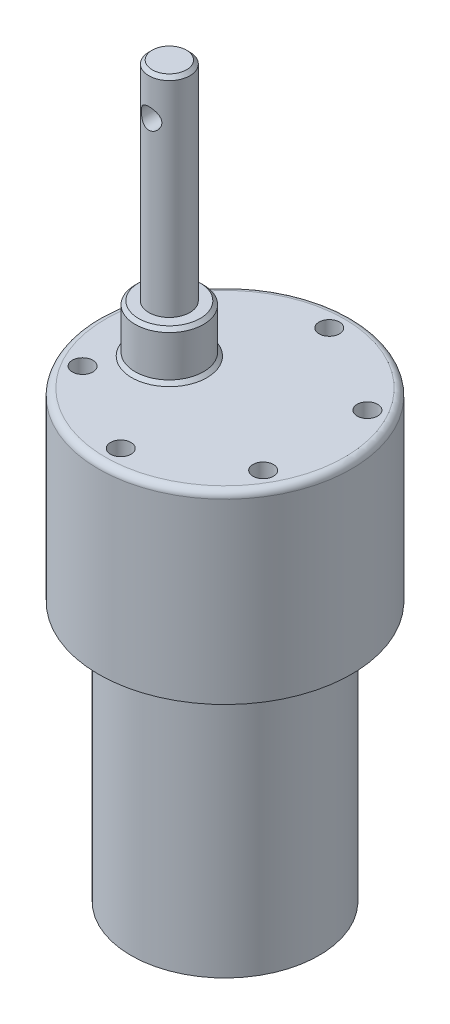
ISO-10303-21;
HEADER;
FILE_DESCRIPTION(('STEP AP214'),'2;1');
FILE_NAME('part.step','',(''),(''),'','','');
FILE_SCHEMA(('AUTOMOTIVE_DESIGN { 1 0 10303 214 1 1 1 1 }'));
ENDSEC;
DATA;
#1=APPLICATION_CONTEXT('core data for automotive mechanical design processes');
#2=APPLICATION_PROTOCOL_DEFINITION('international standard','automotive_design',2000,#1);
#3=PRODUCT_CONTEXT('',#1,'mechanical');
#4=PRODUCT('Part','Part','',(#3));
#5=PRODUCT_RELATED_PRODUCT_CATEGORY('part','',(#4));
#6=PRODUCT_DEFINITION_FORMATION('','',#4);
#7=PRODUCT_DEFINITION_CONTEXT('part definition',#1,'design');
#8=PRODUCT_DEFINITION('design','',#6,#7);
#9=PRODUCT_DEFINITION_SHAPE('','',#8);
#10=(LENGTH_UNIT() NAMED_UNIT(*) SI_UNIT(.MILLI.,.METRE.));
#11=(NAMED_UNIT(*) PLANE_ANGLE_UNIT() SI_UNIT($,.RADIAN.));
#12=(NAMED_UNIT(*) SI_UNIT($,.STERADIAN.) SOLID_ANGLE_UNIT());
#13=UNCERTAINTY_MEASURE_WITH_UNIT(LENGTH_MEASURE(1.E-05),#10,'distance_accuracy_value','');
#14=(GEOMETRIC_REPRESENTATION_CONTEXT(3) GLOBAL_UNCERTAINTY_ASSIGNED_CONTEXT((#13)) GLOBAL_UNIT_ASSIGNED_CONTEXT((#10,
#11,#12)) REPRESENTATION_CONTEXT('',''));
#15=CARTESIAN_POINT('',(0.,0.,0.));
#16=DIRECTION('',(0.,0.,1.));
#17=DIRECTION('',(1.,0.,0.));
#18=AXIS2_PLACEMENT_3D('',#15,#16,#17);
#19=CARTESIAN_POINT('',(-8.14075440092305,104.5,0.));
#20=DIRECTION('',(0.,-1.,0.));
#21=DIRECTION('',(0.,0.,-1.));
#22=AXIS2_PLACEMENT_3D('',#19,#20,#21);
#23=CYLINDRICAL_SURFACE('',#22,3.);
#24=CARTESIAN_POINT('',(-8.14075440092305,104.,0.));
#25=DIRECTION('',(0.,1.,0.));
#26=DIRECTION('',(0.,0.,1.));
#27=AXIS2_PLACEMENT_3D('',#24,#25,#26);
#28=CIRCLE('',#27,3.);
#29=CARTESIAN_POINT('',(-8.14075440092305,104.,3.));
#30=VERTEX_POINT('',#29);
#31=EDGE_CURVE('E45',#30,#30,#28,.F.);
#32=ORIENTED_EDGE('',*,*,#31,.T.);
#33=EDGE_LOOP('',(#32));
#34=FACE_BOUND('',#33,.T.);
#35=CARTESIAN_POINT('',(-8.14075440092305,74.,0.));
#36=DIRECTION('',(0.,1.,0.));
#37=DIRECTION('',(0.,0.,1.));
#38=AXIS2_PLACEMENT_3D('',#35,#36,#37);
#39=CIRCLE('',#38,3.);
#40=CARTESIAN_POINT('',(-8.14075440092305,74.,3.));
#41=VERTEX_POINT('',#40);
#42=EDGE_CURVE('E172',#41,#41,#39,.T.);
#43=ORIENTED_EDGE('',*,*,#42,.T.);
#44=EDGE_LOOP('',(#43));
#45=FACE_BOUND('',#44,.T.);
#46=CARTESIAN_POINT('',(-9.64075440092305,98.6,2.59807621135332));
#47=CARTESIAN_POINT('',(-9.64074894553484,98.5218382877071,2.59808302092689));
#48=CARTESIAN_POINT('',(-9.63460435702287,98.4435778827124,2.60165701781635));
#49=CARTESIAN_POINT('',(-9.61033921577012,98.2894591029843,2.61543549678079));
#50=CARTESIAN_POINT('',(-9.59219349775431,98.2136061274349,2.62565391083339));
#51=CARTESIAN_POINT('',(-9.54490432397276,98.0668225034841,2.65124019908098));
#52=CARTESIAN_POINT('',(-9.51581932966364,97.9958680212896,2.66658065209878));
#53=CARTESIAN_POINT('',(-9.4476556889876,97.8598636970049,2.70063997225287));
#54=CARTESIAN_POINT('',(-9.4085765019767,97.7948141746063,2.71935902214097));
#55=CARTESIAN_POINT('',(-9.31775421171936,97.6665414071637,2.75995303586162));
#56=CARTESIAN_POINT('',(-9.26523245513869,97.6039112964897,2.78196095456931));
#57=CARTESIAN_POINT('',(-9.15063511234474,97.4878874173899,2.82557974178559));
#58=CARTESIAN_POINT('',(-9.08855478959648,97.4344982561247,2.84719040746875));
#59=CARTESIAN_POINT('',(-8.95148874604486,97.3349492732785,2.88932215429424));
#60=CARTESIAN_POINT('',(-8.8759151844419,97.2895193482107,2.90967159627259));
#61=CARTESIAN_POINT('',(-8.71698994082229,97.2122887201314,2.94526134149294));
#62=CARTESIAN_POINT('',(-8.63364320813027,97.1804794157943,2.96050486775612));
#63=CARTESIAN_POINT('',(-8.46782181681201,97.1337430080484,2.98320691866356));
#64=CARTESIAN_POINT('',(-8.38570708665627,97.1177757104667,2.99114220331338));
#65=CARTESIAN_POINT('',(-8.21961034396982,97.0997508219874,3.00011375769101));
#66=CARTESIAN_POINT('',(-8.13562949215744,97.0976848148064,3.00115420176885));
#67=CARTESIAN_POINT('',(-7.97600561428742,97.1071200109555,2.99644472874675));
#68=CARTESIAN_POINT('',(-7.90027260215786,97.1174570232818,2.99127743838241));
#69=CARTESIAN_POINT('',(-7.75178374304556,97.149321265857,2.97561367889621));
#70=CARTESIAN_POINT('',(-7.67902811928216,97.1708493334643,2.96511681099591));
#71=CARTESIAN_POINT('',(-7.53729031356872,97.2246238491347,2.93957374931482));
#72=CARTESIAN_POINT('',(-7.46837426565028,97.2570144697581,2.92446662293799));
#73=CARTESIAN_POINT('',(-7.33678919865305,97.3313951243022,2.89106468980031));
#74=CARTESIAN_POINT('',(-7.27412242766508,97.3733885949535,2.87276874236226));
#75=CARTESIAN_POINT('',(-7.15049390957575,97.4703430272995,2.83266591598844));
#76=CARTESIAN_POINT('',(-7.09025328837901,97.526154542489,2.81069063997263));
#77=CARTESIAN_POINT('',(-6.97959784547638,97.6468845873953,2.76681510880218));
#78=CARTESIAN_POINT('',(-6.9291905835617,97.7118100584111,2.74491492398443));
#79=CARTESIAN_POINT('',(-6.83649639895973,97.8539722886361,2.70216234138727));
#80=CARTESIAN_POINT('',(-6.79492842845597,97.9317290345813,2.68146479986061));
#81=CARTESIAN_POINT('',(-6.7257757314212,98.0944065070385,2.64563175417864));
#82=CARTESIAN_POINT('',(-6.69817641360671,98.1793196495263,2.63049045069101));
#83=CARTESIAN_POINT('',(-6.65998408438549,98.3468217669242,2.60916953725552));
#84=CARTESIAN_POINT('',(-6.64821671774308,98.4290616785653,2.60237483772745));
#85=CARTESIAN_POINT('',(-6.6384789810059,98.5946020122748,2.59676879042414));
#86=CARTESIAN_POINT('',(-6.64049886495051,98.6779016436797,2.59795180333967));
#87=CARTESIAN_POINT('',(-6.6572003359071,98.8334808778681,2.60751504810877));
#88=CARTESIAN_POINT('',(-6.67047267585435,98.9059691766619,2.61509381259981));
#89=CARTESIAN_POINT('',(-6.70720997397439,99.0475516794064,2.63541032327012));
#90=CARTESIAN_POINT('',(-6.73067823298762,99.1166447761199,2.64814974007551));
#91=CARTESIAN_POINT('',(-6.78828301801571,99.253116996354,2.67804333119485));
#92=CARTESIAN_POINT('',(-6.82286330538396,99.3202685252803,2.69537464864595));
#93=CARTESIAN_POINT('',(-6.90132380489934,99.4482039073085,2.73234179245875));
#94=CARTESIAN_POINT('',(-6.94520879442473,99.5089844652699,2.75197880032722));
#95=CARTESIAN_POINT('',(-7.04749865012477,99.6304681512853,2.79431997684504));
#96=CARTESIAN_POINT('',(-7.1070364924506,99.6901957260765,2.81709874731434));
#97=CARTESIAN_POINT('',(-7.23564765782562,99.7991183569904,2.86101352466839));
#98=CARTESIAN_POINT('',(-7.30472418894003,99.8483098553458,2.88214897511564));
#99=CARTESIAN_POINT('',(-7.45295135708491,99.9358605889252,2.92112042536435));
#100=CARTESIAN_POINT('',(-7.53231975456187,99.9738996773164,2.93885462508044));
#101=CARTESIAN_POINT('',(-7.69747085396142,100.035706855786,2.96825032438951));
#102=CARTESIAN_POINT('',(-7.78324784883478,100.059487477049,2.9799171551456));
#103=CARTESIAN_POINT('',(-7.95028487742742,100.090052846262,2.99501262272824));
#104=CARTESIAN_POINT('',(-8.03123723514736,100.098196813814,2.99909891862287));
#105=CARTESIAN_POINT('',(-8.19344337984985,100.101264898182,3.00063195562697));
#106=CARTESIAN_POINT('',(-8.27469705136568,100.096193642785,2.99808102100335));
#107=CARTESIAN_POINT('',(-8.42956138939877,100.073875389807,2.98700953256884));
#108=CARTESIAN_POINT('',(-8.50332287763995,100.057452726113,2.97889342001985));
#109=CARTESIAN_POINT('',(-8.64692332919848,100.014009501046,2.95788140495135));
#110=CARTESIAN_POINT('',(-8.71676172835631,99.9869874198598,2.94498481699193));
#111=CARTESIAN_POINT('',(-8.85388951029038,99.9219094217511,2.9148889612218));
#112=CARTESIAN_POINT('',(-8.92094211497312,99.8834310151883,2.89752925798198));
#113=CARTESIAN_POINT('',(-9.04791636364408,99.7970631037114,2.86032199712739));
#114=CARTESIAN_POINT('',(-9.10783471204541,99.7491692763265,2.84047329837541));
#115=CARTESIAN_POINT('',(-9.22512540715839,99.6398042914659,2.79792915339941));
#116=CARTESIAN_POINT('',(-9.28165092773196,99.5774562687842,2.77514698517547));
#117=CARTESIAN_POINT('',(-9.38374933201506,99.4438239183054,2.73094614244278));
#118=CARTESIAN_POINT('',(-9.42931252593814,99.3725317686985,2.70952868642798));
#119=CARTESIAN_POINT('',(-9.50940102060153,99.2200450301286,2.66999407957374));
#120=CARTESIAN_POINT('',(-9.54353199986446,99.1386087033069,2.65200261384405));
#121=CARTESIAN_POINT('',(-9.59707246518266,98.9700013934903,2.62299234492527));
#122=CARTESIAN_POINT('',(-9.61653118768607,98.882850666631,2.61195024221553));
#123=CARTESIAN_POINT('',(-9.63230491271967,98.762291966522,2.60293908902686));
#124=CARTESIAN_POINT('',(-9.63546855836882,98.7299481584032,2.60112193507728));
#125=CARTESIAN_POINT('',(-9.63969450855799,98.6650752789766,2.59868903831625));
#126=CARTESIAN_POINT('',(-9.64075667252285,98.6325461954212,2.59807337587664));
#127=CARTESIAN_POINT('',(-9.64075440092305,98.6,2.59807621135332));
#128=B_SPLINE_CURVE_WITH_KNOTS('',3,(#46,#47,#48,#49,#50,#51,#52,#53,#54,#55,#56,#57,#58,#59,
#60,#61,#62,#63,#64,#65,#66,#67,#68,#69,#70,#71,#72,#73,#74,#75,#76,#77,#78,#79,#80,#81,#82,#83,
#84,#85,#86,#87,#88,#89,#90,#91,#92,#93,#94,#95,#96,#97,#98,#99,#100,#101,#102,#103,#104,#105,
#106,#107,#108,#109,#110,#111,#112,#113,#114,#115,#116,#117,#118,#119,#120,#121,#122,#123,#124,
#125,#126,#127),.UNSPECIFIED.,.T.,.F.,(4,2,2,2,2,2,2,2,2,2,2,2,2,2,2,2,2,2,2,2,2,2,2,2,2,2,2,2,
2,2,2,2,2,2,2,2,2,2,2,2,4),(0.,0.234348183892079,0.469189339237211,0.702792893878336,
0.936409088167741,1.18929346874736,1.44230356626558,1.71236838358146,1.98226240445837,
2.23295227451903,2.4834903552906,2.71224146226807,2.94100968776183,3.1729430209672,
3.40495949025408,3.65890787185336,3.91305072368878,4.18333262594172,4.45333161317557,
4.70193436281319,4.95036139782561,5.17161275136039,5.39293578654094,5.62450944609131,
5.85620229330071,6.11710115370921,6.37808797467302,6.64596272119448,6.91360169713157,
7.1566840558423,7.39968130190958,7.6266663730724,7.8536840026802,8.09041126079208,
8.32724745151079,8.58765362775102,8.84828914267732,9.11716123557908,9.38512699504142,
9.48270202777964,9.58028358741811),.UNSPECIFIED.);
#129=CARTESIAN_POINT('',(-9.64075440092305,98.6,2.59807621135332));
#130=VERTEX_POINT('',#129);
#131=EDGE_CURVE('E86',#130,#130,#128,.T.);
#132=ORIENTED_EDGE('',*,*,#131,.F.);
#133=EDGE_LOOP('',(#132));
#134=FACE_BOUND('',#133,.T.);
#135=CARTESIAN_POINT('',(-8.14075440092305,100.1,-3.));
#136=CARTESIAN_POINT('',(-8.06189645649619,100.099995046524,-2.99999570107562));
#137=CARTESIAN_POINT('',(-7.9829445013767,100.093744890318,-2.99685736529635));
#138=CARTESIAN_POINT('',(-7.8273740480197,100.069020679488,-2.98461234055736));
#139=CARTESIAN_POINT('',(-7.7507602708526,100.050523410503,-2.97549431743379));
#140=CARTESIAN_POINT('',(-7.60235408360237,100.002209287075,-2.95224419105063));
#141=CARTESIAN_POINT('',(-7.53054419651432,99.9724364236281,-2.93813158766306));
#142=CARTESIAN_POINT('',(-7.39304547571314,99.9026440679525,-2.90618664773642));
#143=CARTESIAN_POINT('',(-7.32735615993795,99.8626253836267,-2.88835460450288));
#144=CARTESIAN_POINT('',(-7.19949267428018,99.7707241257721,-2.84934387387093));
#145=CARTESIAN_POINT('',(-7.13777158423988,99.7182702811405,-2.82802798691306));
#146=CARTESIAN_POINT('',(-7.02358523362258,99.6042177811294,-2.78489955370115));
#147=CARTESIAN_POINT('',(-6.97112702626289,99.5426122223413,-2.76308664313552));
#148=CARTESIAN_POINT('',(-6.87287640024763,99.4062749757149,-2.71948426796021));
#149=CARTESIAN_POINT('',(-6.82791639759559,99.3308958524811,-2.69782780455198));
#150=CARTESIAN_POINT('',(-6.751502060587,99.1724489960207,-2.65928968158481));
#151=CARTESIAN_POINT('',(-6.72003807847354,99.0893868069159,-2.64240461410484));
#152=CARTESIAN_POINT('',(-6.67355573764016,98.9230023418671,-2.61686800556713));
#153=CARTESIAN_POINT('',(-6.65766561530238,98.8399933218989,-2.6077840737557));
#154=CARTESIAN_POINT('',(-6.64011391095978,98.6720317433308,-2.59772834922792));
#155=CARTESIAN_POINT('',(-6.63843826836343,98.5870811886933,-2.59674854014932));
#156=CARTESIAN_POINT('',(-6.6487234701646,98.428570963527,-2.60266395385873));
#157=CARTESIAN_POINT('',(-6.65907756161781,98.3548639531654,-2.6086314549302));
#158=CARTESIAN_POINT('',(-6.69034462733765,98.2104171359404,-2.62614343100775));
#159=CARTESIAN_POINT('',(-6.71126096507656,98.139678282042,-2.63768968247664));
#160=CARTESIAN_POINT('',(-6.76343973034404,98.0011563011515,-2.66531214619111));
#161=CARTESIAN_POINT('',(-6.79493180024905,97.9334804018213,-2.68148760995998));
#162=CARTESIAN_POINT('',(-6.86719186942104,97.804048561115,-2.71655106422105));
#163=CARTESIAN_POINT('',(-6.90796403520434,97.7422952965999,-2.73544027170286));
#164=CARTESIAN_POINT('',(-7.00365531855386,97.6182181208852,-2.77669736854929));
#165=CARTESIAN_POINT('',(-7.05971271336912,97.5568146896358,-2.79920265355119));
#166=CARTESIAN_POINT('',(-7.18142103281099,97.4438968721136,-2.84321434950611));
#167=CARTESIAN_POINT('',(-7.24707651606162,97.3923872119492,-2.86472027938201));
#168=CARTESIAN_POINT('',(-7.38997964217527,97.2984715084554,-2.90552980924446));
#169=CARTESIAN_POINT('',(-7.46762401352394,97.2565992913314,-2.92468476243011));
#170=CARTESIAN_POINT('',(-7.63005507768985,97.1868544564355,-2.95736821681863));
#171=CARTESIAN_POINT('',(-7.71483603652513,97.1589707224772,-2.9709011841533));
#172=CARTESIAN_POINT('',(-7.88160466343199,97.120286894425,-2.98986500612153));
#173=CARTESIAN_POINT('',(-7.96324210510055,97.1082631463798,-2.99587407451965));
#174=CARTESIAN_POINT('',(-8.12758500099901,97.0978029032983,-3.00109520188655));
#175=CARTESIAN_POINT('',(-8.2102899307279,97.0993599715408,-3.00031048081978));
#176=CARTESIAN_POINT('',(-8.36760385890202,97.1153100326281,-2.99236788380152));
#177=CARTESIAN_POINT('',(-8.44234351299794,97.128698799095,-2.98570868532252));
#178=CARTESIAN_POINT('',(-8.58836473937596,97.1663571078427,-2.9673325697226));
#179=CARTESIAN_POINT('',(-8.65964592945967,97.1906278496802,-2.95561509501618));
#180=CARTESIAN_POINT('',(-8.7990873135974,97.2499976996496,-2.92776377120382));
#181=CARTESIAN_POINT('',(-8.86709999643175,97.2853865751744,-2.91151322654446));
#182=CARTESIAN_POINT('',(-8.99644644347195,97.3656613034698,-2.87615961476126));
#183=CARTESIAN_POINT('',(-9.05777734558793,97.4105512018931,-2.85705533350407));
#184=CARTESIAN_POINT('',(-9.17840593485687,97.5136406379961,-2.81562332004297));
#185=CARTESIAN_POINT('',(-9.23691251765158,97.5727143026677,-2.79316327265249));
#186=CARTESIAN_POINT('',(-9.34353888260133,97.6998877269166,-2.7489358741323));
#187=CARTESIAN_POINT('',(-9.39165147949085,97.7679936782719,-2.72716901100071));
#188=CARTESIAN_POINT('',(-9.47831627264157,97.9154654812595,-2.68576788309734));
#189=CARTESIAN_POINT('',(-9.51629264462342,97.9952168991417,-2.66628794383591));
#190=CARTESIAN_POINT('',(-9.5778786398251,98.1612651013625,-2.63361108441202));
#191=CARTESIAN_POINT('',(-9.60150677472357,98.2475532897003,-2.62040607332625));
#192=CARTESIAN_POINT('',(-9.63154693212335,98.4153653343271,-2.60342251538703));
#193=CARTESIAN_POINT('',(-9.63939389553122,98.4965513801529,-2.59886075197597));
#194=CARTESIAN_POINT('',(-9.64178813248735,98.6591706007468,-2.59748031962405));
#195=CARTESIAN_POINT('',(-9.63634117085791,98.7406036531068,-2.60065829439585));
#196=CARTESIAN_POINT('',(-9.61364358931301,98.8932252523002,-2.61356793076615));
#197=CARTESIAN_POINT('',(-9.5975668724376,98.9646507052171,-2.62264641723988));
#198=CARTESIAN_POINT('',(-9.55551743825966,99.1037121791366,-2.64556524281479));
#199=CARTESIAN_POINT('',(-9.52954153766293,99.171346973138,-2.65940711354503));
#200=CARTESIAN_POINT('',(-9.46647801887389,99.3059372764798,-2.69142795546804));
#201=CARTESIAN_POINT('',(-9.4287611076466,99.3725418527436,-2.70983583593881));
#202=CARTESIAN_POINT('',(-9.34398085837914,99.4989118042719,-2.7485299745229));
#203=CARTESIAN_POINT('',(-9.29691265778539,99.5586735957817,-2.76881720693416));
#204=CARTESIAN_POINT('',(-9.18805939091511,99.677212973532,-2.81193484737138));
#205=CARTESIAN_POINT('',(-9.12518103541895,99.7349886535254,-2.83477474959942));
#206=CARTESIAN_POINT('',(-8.98998661027285,99.8393944751529,-2.87816628389896));
#207=CARTESIAN_POINT('',(-8.91766548588085,99.8860186092049,-2.89871667939292));
#208=CARTESIAN_POINT('',(-8.76465179609746,99.9668545440681,-2.93547014349806));
#209=CARTESIAN_POINT('',(-8.68390365658814,100.000976253855,-2.95164144740899));
#210=CARTESIAN_POINT('',(-8.51686755263017,100.054712251636,-2.9775201194848));
#211=CARTESIAN_POINT('',(-8.43059610030669,100.074367770209,-2.98724585044602));
#212=CARTESIAN_POINT('',(-8.30965732065938,100.090846116629,-2.99543192870217));
#213=CARTESIAN_POINT('',(-8.27599722008539,100.0942739613,-2.99714048010376));
#214=CARTESIAN_POINT('',(-8.20848199863068,100.098851998271,-2.99942545465223));
#215=CARTESIAN_POINT('',(-8.17462687239298,100.100002127705,-3.00000184655071));
#216=CARTESIAN_POINT('',(-8.14075440092305,100.1,-3.));
#217=B_SPLINE_CURVE_WITH_KNOTS('',3,(#135,#136,#137,#138,#139,#140,#141,#142,#143,#144,#145,
#146,#147,#148,#149,#150,#151,#152,#153,#154,#155,#156,#157,#158,#159,#160,#161,#162,#163,#164,
#165,#166,#167,#168,#169,#170,#171,#172,#173,#174,#175,#176,#177,#178,#179,#180,#181,#182,#183,
#184,#185,#186,#187,#188,#189,#190,#191,#192,#193,#194,#195,#196,#197,#198,#199,#200,#201,#202,
#203,#204,#205,#206,#207,#208,#209,#210,#211,#212,#213,#214,#215,#216),.UNSPECIFIED.,.T.,.F.,(4,
2,2,2,2,2,2,2,2,2,2,2,2,2,2,2,2,2,2,2,2,2,2,2,2,2,2,2,2,2,2,2,2,2,2,2,2,2,2,2,4),(0.,
0.236436386130441,0.473322224563798,0.709293233238445,0.945245640872355,1.19547263807713,
1.44588935648105,1.7157258964613,1.98536921847421,2.23887018210343,2.4921203599353,
2.71508568613982,2.93812205888517,3.16635360252731,3.39468781890332,3.65197412000818,
3.9093830189803,4.17874533321662,4.44789325368419,4.69474935707018,4.94148846767214,
5.16910359759183,5.39674382446397,5.63089284041848,5.86514176122509,6.12239415966629,
6.37982382923147,6.6497202324259,6.91926767918176,7.1629396125457,7.40650589797018,
7.62686895373282,7.84730293182526,8.0825468517043,8.31791341715445,8.58187864135756,
8.84598575071868,9.1119602049529,9.37717362931724,9.47872920200876,9.58028757766599),.UNSPECIFIED.);
#218=CARTESIAN_POINT('',(-8.14075440092305,100.1,-3.));
#219=VERTEX_POINT('',#218);
#220=EDGE_CURVE('E78',#219,#219,#217,.T.);
#221=ORIENTED_EDGE('',*,*,#220,.F.);
#222=EDGE_LOOP('',(#221));
#223=FACE_BOUND('',#222,.T.);
#224=ADVANCED_FACE('F33',(#34,#45,#134,#223),#23,.T.);
#225=CARTESIAN_POINT('',(0.,67.,0.));
#226=DIRECTION('',(0.,-1.,0.));
#227=DIRECTION('',(0.,0.,-1.));
#228=AXIS2_PLACEMENT_3D('',#225,#226,#227);
#229=PLANE('',#228);
#230=CARTESIAN_POINT('',(0.,67.,0.));
#231=DIRECTION('',(0.,-1.,0.));
#232=DIRECTION('',(0.,0.,-1.));
#233=AXIS2_PLACEMENT_3D('',#230,#231,#232);
#234=CIRCLE('',#233,17.5);
#235=CARTESIAN_POINT('',(0.,67.,-17.5));
#236=VERTEX_POINT('',#235);
#237=EDGE_CURVE('E41',#236,#236,#234,.F.);
#238=ORIENTED_EDGE('',*,*,#237,.T.);
#239=EDGE_LOOP('',(#238));
#240=FACE_BOUND('',#239,.T.);
#241=CARTESIAN_POINT('',(-8.14075440092305,67.,0.));
#242=DIRECTION('',(0.,-1.,0.));
#243=DIRECTION('',(0.,0.,-1.));
#244=AXIS2_PLACEMENT_3D('',#241,#242,#243);
#245=CIRCLE('',#244,5.49999999999999);
#246=CARTESIAN_POINT('',(-8.14075440092305,67.,-5.49999999999999));
#247=VERTEX_POINT('',#246);
#248=EDGE_CURVE('E68',#247,#247,#245,.T.);
#249=ORIENTED_EDGE('',*,*,#248,.T.);
#250=EDGE_LOOP('',(#249));
#251=FACE_BOUND('',#250,.T.);
#252=CARTESIAN_POINT('',(13.2068874077127,67.,-7.62499999999991));
#253=DIRECTION('',(0.,1.,0.));
#254=DIRECTION('',(0.,0.,1.));
#255=AXIS2_PLACEMENT_3D('',#252,#253,#254);
#256=CIRCLE('',#255,1.49999999999994);
#257=CARTESIAN_POINT('',(13.2068874077127,67.,-6.12499999999998));
#258=VERTEX_POINT('',#257);
#259=EDGE_CURVE('E191',#258,#258,#256,.T.);
#260=ORIENTED_EDGE('',*,*,#259,.F.);
#261=EDGE_LOOP('',(#260));
#262=FACE_BOUND('',#261,.T.);
#263=CARTESIAN_POINT('',(13.2068874077129,67.,7.62500000000009));
#264=DIRECTION('',(0.,1.,0.));
#265=DIRECTION('',(0.,0.,1.));
#266=AXIS2_PLACEMENT_3D('',#263,#264,#265);
#267=CIRCLE('',#266,1.50000000000002);
#268=CARTESIAN_POINT('',(13.2068874077129,67.,9.12500000000011));
#269=VERTEX_POINT('',#268);
#270=EDGE_CURVE('E197',#269,#269,#267,.T.);
#271=ORIENTED_EDGE('',*,*,#270,.F.);
#272=EDGE_LOOP('',(#271));
#273=FACE_BOUND('',#272,.T.);
#274=CARTESIAN_POINT('',(2.17809831826543E-13,67.,15.2500000000002));
#275=DIRECTION('',(0.,1.,0.));
#276=DIRECTION('',(0.,0.,1.));
#277=AXIS2_PLACEMENT_3D('',#274,#275,#276);
#278=CIRCLE('',#277,1.50000000000026);
#279=CARTESIAN_POINT('',(2.17809831826543E-13,67.,16.7500000000004));
#280=VERTEX_POINT('',#279);
#281=EDGE_CURVE('E203',#280,#280,#278,.T.);
#282=ORIENTED_EDGE('',*,*,#281,.F.);
#283=EDGE_LOOP('',(#282));
#284=FACE_BOUND('',#283,.T.);
#285=CARTESIAN_POINT('',(-13.2068874077125,67.,7.62500000000029));
#286=DIRECTION('',(0.,1.,0.));
#287=DIRECTION('',(0.,0.,1.));
#288=AXIS2_PLACEMENT_3D('',#285,#286,#287);
#289=CIRCLE('',#288,1.50000000000045);
#290=CARTESIAN_POINT('',(-13.2068874077125,67.,9.12500000000074));
#291=VERTEX_POINT('',#290);
#292=EDGE_CURVE('E209',#291,#291,#289,.T.);
#293=ORIENTED_EDGE('',*,*,#292,.F.);
#294=EDGE_LOOP('',(#293));
#295=FACE_BOUND('',#294,.T.);
#296=CARTESIAN_POINT('',(-13.2068874077127,67.,-7.62499999999999));
#297=DIRECTION('',(0.,1.,0.));
#298=DIRECTION('',(0.,0.,1.));
#299=AXIS2_PLACEMENT_3D('',#296,#297,#298);
#300=CIRCLE('',#299,1.50000000000018);
#301=CARTESIAN_POINT('',(-13.2068874077127,67.,-6.12499999999981));
#302=VERTEX_POINT('',#301);
#303=EDGE_CURVE('E85',#302,#302,#300,.T.);
#304=ORIENTED_EDGE('',*,*,#303,.F.);
#305=EDGE_LOOP('',(#304));
#306=FACE_BOUND('',#305,.T.);
#307=CARTESIAN_POINT('',(0.,67.,-15.2499999999998));
#308=DIRECTION('',(0.,1.,0.));
#309=DIRECTION('',(0.,0.,1.));
#310=AXIS2_PLACEMENT_3D('',#307,#308,#309);
#311=CIRCLE('',#310,1.50000000000005);
#312=CARTESIAN_POINT('',(0.,67.,-13.7499999999998));
#313=VERTEX_POINT('',#312);
#314=EDGE_CURVE('E190',#313,#313,#311,.T.);
#315=ORIENTED_EDGE('',*,*,#314,.F.);
#316=EDGE_LOOP('',(#315));
#317=FACE_BOUND('',#316,.T.);
#318=ADVANCED_FACE('F159',(#240,#251,#262,#273,#284,#295,#306,#317),#229,.F.);
#319=CARTESIAN_POINT('',(0.,116.312873797507,0.));
#320=DIRECTION('',(0.,1.,0.));
#321=DIRECTION('',(0.,0.,1.));
#322=AXIS2_PLACEMENT_3D('',#319,#320,#321);
#323=CYLINDRICAL_SURFACE('',#322,18.5);
#324=CARTESIAN_POINT('',(0.,66.,0.));
#325=DIRECTION('',(0.,-1.,0.));
#326=DIRECTION('',(0.,0.,-1.));
#327=AXIS2_PLACEMENT_3D('',#324,#325,#326);
#328=CIRCLE('',#327,18.5);
#329=CARTESIAN_POINT('',(0.,66.,-18.5));
#330=VERTEX_POINT('',#329);
#331=EDGE_CURVE('E10',#330,#330,#328,.T.);
#332=ORIENTED_EDGE('',*,*,#331,.T.);
#333=EDGE_LOOP('',(#332));
#334=FACE_BOUND('',#333,.T.);
#335=CARTESIAN_POINT('',(0.,40.,0.));
#336=DIRECTION('',(0.,1.,0.));
#337=DIRECTION('',(0.,0.,1.));
#338=AXIS2_PLACEMENT_3D('',#335,#336,#337);
#339=CIRCLE('',#338,18.5);
#340=CARTESIAN_POINT('',(0.,40.,18.5));
#341=VERTEX_POINT('',#340);
#342=EDGE_CURVE('E77',#341,#341,#339,.T.);
#343=ORIENTED_EDGE('',*,*,#342,.T.);
#344=EDGE_LOOP('',(#343));
#345=FACE_BOUND('',#344,.T.);
#346=ADVANCED_FACE('F164',(#334,#345),#323,.T.);
#347=CARTESIAN_POINT('',(18.5,40.,0.));
#348=DIRECTION('',(0.,1.,0.));
#349=DIRECTION('',(0.,0.,1.));
#350=AXIS2_PLACEMENT_3D('',#347,#348,#349);
#351=PLANE('',#350);
#352=ORIENTED_EDGE('',*,*,#342,.F.);
#353=EDGE_LOOP('',(#352));
#354=FACE_BOUND('',#353,.T.);
#355=CARTESIAN_POINT('',(0.,40.,0.));
#356=DIRECTION('',(0.,1.,0.));
#357=DIRECTION('',(0.,0.,1.));
#358=AXIS2_PLACEMENT_3D('',#355,#356,#357);
#359=CIRCLE('',#358,12.2695434015442);
#360=CARTESIAN_POINT('',(0.,40.,12.2695434015442));
#361=VERTEX_POINT('',#360);
#362=EDGE_CURVE('E179',#361,#361,#359,.T.);
#363=ORIENTED_EDGE('',*,*,#362,.T.);
#364=EDGE_LOOP('',(#363));
#365=FACE_BOUND('',#364,.T.);
#366=ADVANCED_FACE('F229',(#354,#365),#351,.F.);
#367=CARTESIAN_POINT('',(-8.14075440092305,74.,0.));
#368=DIRECTION('',(0.,-1.,0.));
#369=DIRECTION('',(0.,0.,-1.));
#370=AXIS2_PLACEMENT_3D('',#367,#368,#369);
#371=CYLINDRICAL_SURFACE('',#370,5.);
#372=CARTESIAN_POINT('',(-8.14075440092305,67.5,0.));
#373=DIRECTION('',(0.,-1.,0.));
#374=DIRECTION('',(0.,0.,-1.));
#375=AXIS2_PLACEMENT_3D('',#372,#373,#374);
#376=CIRCLE('',#375,5.);
#377=CARTESIAN_POINT('',(-8.14075440092305,67.5,-5.));
#378=VERTEX_POINT('',#377);
#379=EDGE_CURVE('E71',#378,#378,#376,.F.);
#380=ORIENTED_EDGE('',*,*,#379,.T.);
#381=EDGE_LOOP('',(#380));
#382=FACE_BOUND('',#381,.T.);
#383=CARTESIAN_POINT('',(-8.14075440092305,73.5,0.));
#384=DIRECTION('',(0.,1.,0.));
#385=DIRECTION('',(0.,0.,1.));
#386=AXIS2_PLACEMENT_3D('',#383,#384,#385);
#387=CIRCLE('',#386,5.);
#388=CARTESIAN_POINT('',(-8.14075440092305,73.5,5.));
#389=VERTEX_POINT('',#388);
#390=EDGE_CURVE('E74',#389,#389,#387,.F.);
#391=ORIENTED_EDGE('',*,*,#390,.T.);
#392=EDGE_LOOP('',(#391));
#393=FACE_BOUND('',#392,.T.);
#394=ADVANCED_FACE('F156',(#382,#393),#371,.T.);
#395=CARTESIAN_POINT('',(-8.14075440092305,74.,0.));
#396=DIRECTION('',(0.,1.,0.));
#397=DIRECTION('',(0.,0.,1.));
#398=AXIS2_PLACEMENT_3D('',#395,#396,#397);
#399=PLANE('',#398);
#400=CARTESIAN_POINT('',(-8.14075440092305,74.,0.));
#401=DIRECTION('',(0.,1.,0.));
#402=DIRECTION('',(0.,0.,1.));
#403=AXIS2_PLACEMENT_3D('',#400,#401,#402);
#404=CIRCLE('',#403,4.5);
#405=CARTESIAN_POINT('',(-8.14075440092305,74.,4.5));
#406=VERTEX_POINT('',#405);
#407=EDGE_CURVE('E65',#406,#406,#404,.T.);
#408=ORIENTED_EDGE('',*,*,#407,.T.);
#409=EDGE_LOOP('',(#408));
#410=FACE_BOUND('',#409,.T.);
#411=ORIENTED_EDGE('',*,*,#42,.F.);
#412=EDGE_LOOP('',(#411));
#413=FACE_BOUND('',#412,.T.);
#414=ADVANCED_FACE('F151',(#410,#413),#399,.T.);
#415=CARTESIAN_POINT('',(-8.14075440092305,104.5,0.));
#416=DIRECTION('',(0.,1.,0.));
#417=DIRECTION('',(0.,0.,1.));
#418=AXIS2_PLACEMENT_3D('',#415,#416,#417);
#419=PLANE('',#418);
#420=CARTESIAN_POINT('',(-8.14075440092305,104.5,0.));
#421=DIRECTION('',(0.,1.,0.));
#422=DIRECTION('',(0.,0.,1.));
#423=AXIS2_PLACEMENT_3D('',#420,#421,#422);
#424=CIRCLE('',#423,2.50000000000007);
#425=CARTESIAN_POINT('',(-8.14075440092305,104.5,2.50000000000007));
#426=VERTEX_POINT('',#425);
#427=EDGE_CURVE('E50',#426,#426,#424,.T.);
#428=ORIENTED_EDGE('',*,*,#427,.T.);
#429=EDGE_LOOP('',(#428));
#430=FACE_BOUND('',#429,.T.);
#431=ADVANCED_FACE('F148',(#430),#419,.T.);
#432=CARTESIAN_POINT('',(0.,64.,-15.2499999999998));
#433=DIRECTION('',(0.,1.,0.));
#434=DIRECTION('',(0.,0.,1.));
#435=AXIS2_PLACEMENT_3D('',#432,#433,#434);
#436=CYLINDRICAL_SURFACE('',#435,1.50000000000005);
#437=CARTESIAN_POINT('',(0.,64.,-15.2499999999998));
#438=DIRECTION('',(0.,1.,0.));
#439=DIRECTION('',(0.,0.,1.));
#440=AXIS2_PLACEMENT_3D('',#437,#438,#439);
#441=CIRCLE('',#440,1.50000000000005);
#442=CARTESIAN_POINT('',(0.,64.,-13.7499999999998));
#443=VERTEX_POINT('',#442);
#444=EDGE_CURVE('E217',#443,#443,#441,.T.);
#445=ORIENTED_EDGE('',*,*,#444,.F.);
#446=EDGE_LOOP('',(#445));
#447=FACE_BOUND('',#446,.T.);
#448=ORIENTED_EDGE('',*,*,#314,.T.);
#449=EDGE_LOOP('',(#448));
#450=FACE_BOUND('',#449,.T.);
#451=ADVANCED_FACE('F145',(#447,#450),#436,.F.);
#452=CARTESIAN_POINT('',(0.,64.,-15.2499999999998));
#453=DIRECTION('',(0.,1.,0.));
#454=DIRECTION('',(0.,0.,1.));
#455=AXIS2_PLACEMENT_3D('',#452,#453,#454);
#456=PLANE('',#455);
#457=ORIENTED_EDGE('',*,*,#444,.T.);
#458=EDGE_LOOP('',(#457));
#459=FACE_BOUND('',#458,.T.);
#460=ADVANCED_FACE('F141',(#459),#456,.T.);
#461=CARTESIAN_POINT('',(-13.2068874077127,64.,-7.62499999999999));
#462=DIRECTION('',(0.,1.,0.));
#463=DIRECTION('',(0.,0.,1.));
#464=AXIS2_PLACEMENT_3D('',#461,#462,#463);
#465=CYLINDRICAL_SURFACE('',#464,1.50000000000018);
#466=CARTESIAN_POINT('',(-13.2068874077127,64.,-7.62499999999999));
#467=DIRECTION('',(0.,1.,0.));
#468=DIRECTION('',(0.,0.,1.));
#469=AXIS2_PLACEMENT_3D('',#466,#467,#468);
#470=CIRCLE('',#469,1.50000000000018);
#471=CARTESIAN_POINT('',(-13.2068874077127,64.,-6.12499999999981));
#472=VERTEX_POINT('',#471);
#473=EDGE_CURVE('E212',#472,#472,#470,.T.);
#474=ORIENTED_EDGE('',*,*,#473,.F.);
#475=EDGE_LOOP('',(#474));
#476=FACE_BOUND('',#475,.T.);
#477=ORIENTED_EDGE('',*,*,#303,.T.);
#478=EDGE_LOOP('',(#477));
#479=FACE_BOUND('',#478,.T.);
#480=ADVANCED_FACE('F137',(#476,#479),#465,.F.);
#481=CARTESIAN_POINT('',(-13.2068874077127,64.,-7.62499999999999));
#482=DIRECTION('',(0.,1.,0.));
#483=DIRECTION('',(0.,0.,1.));
#484=AXIS2_PLACEMENT_3D('',#481,#482,#483);
#485=PLANE('',#484);
#486=ORIENTED_EDGE('',*,*,#473,.T.);
#487=EDGE_LOOP('',(#486));
#488=FACE_BOUND('',#487,.T.);
#489=ADVANCED_FACE('F133',(#488),#485,.T.);
#490=CARTESIAN_POINT('',(-13.2068874077125,64.,7.62500000000029));
#491=DIRECTION('',(0.,1.,0.));
#492=DIRECTION('',(0.,0.,1.));
#493=AXIS2_PLACEMENT_3D('',#490,#491,#492);
#494=CYLINDRICAL_SURFACE('',#493,1.50000000000045);
#495=CARTESIAN_POINT('',(-13.2068874077125,64.,7.62500000000029));
#496=DIRECTION('',(0.,1.,0.));
#497=DIRECTION('',(0.,0.,1.));
#498=AXIS2_PLACEMENT_3D('',#495,#496,#497);
#499=CIRCLE('',#498,1.50000000000045);
#500=CARTESIAN_POINT('',(-13.2068874077125,64.,9.12500000000074));
#501=VERTEX_POINT('',#500);
#502=EDGE_CURVE('E206',#501,#501,#499,.T.);
#503=ORIENTED_EDGE('',*,*,#502,.F.);
#504=EDGE_LOOP('',(#503));
#505=FACE_BOUND('',#504,.T.);
#506=ORIENTED_EDGE('',*,*,#292,.T.);
#507=EDGE_LOOP('',(#506));
#508=FACE_BOUND('',#507,.T.);
#509=ADVANCED_FACE('F129',(#505,#508),#494,.F.);
#510=CARTESIAN_POINT('',(-13.2068874077125,64.,7.62500000000029));
#511=DIRECTION('',(0.,1.,0.));
#512=DIRECTION('',(0.,0.,1.));
#513=AXIS2_PLACEMENT_3D('',#510,#511,#512);
#514=PLANE('',#513);
#515=ORIENTED_EDGE('',*,*,#502,.T.);
#516=EDGE_LOOP('',(#515));
#517=FACE_BOUND('',#516,.T.);
#518=ADVANCED_FACE('F125',(#517),#514,.T.);
#519=CARTESIAN_POINT('',(2.17809831826543E-13,64.,15.2500000000002));
#520=DIRECTION('',(0.,1.,0.));
#521=DIRECTION('',(0.,0.,1.));
#522=AXIS2_PLACEMENT_3D('',#519,#520,#521);
#523=CYLINDRICAL_SURFACE('',#522,1.50000000000026);
#524=CARTESIAN_POINT('',(2.17809831826543E-13,64.,15.2500000000002));
#525=DIRECTION('',(0.,1.,0.));
#526=DIRECTION('',(0.,0.,1.));
#527=AXIS2_PLACEMENT_3D('',#524,#525,#526);
#528=CIRCLE('',#527,1.50000000000026);
#529=CARTESIAN_POINT('',(2.17809831826543E-13,64.,16.7500000000004));
#530=VERTEX_POINT('',#529);
#531=EDGE_CURVE('E200',#530,#530,#528,.T.);
#532=ORIENTED_EDGE('',*,*,#531,.F.);
#533=EDGE_LOOP('',(#532));
#534=FACE_BOUND('',#533,.T.);
#535=ORIENTED_EDGE('',*,*,#281,.T.);
#536=EDGE_LOOP('',(#535));
#537=FACE_BOUND('',#536,.T.);
#538=ADVANCED_FACE('F121',(#534,#537),#523,.F.);
#539=CARTESIAN_POINT('',(2.17809831826543E-13,64.,15.2500000000002));
#540=DIRECTION('',(0.,1.,0.));
#541=DIRECTION('',(0.,0.,1.));
#542=AXIS2_PLACEMENT_3D('',#539,#540,#541);
#543=PLANE('',#542);
#544=ORIENTED_EDGE('',*,*,#531,.T.);
#545=EDGE_LOOP('',(#544));
#546=FACE_BOUND('',#545,.T.);
#547=ADVANCED_FACE('F117',(#546),#543,.T.);
#548=CARTESIAN_POINT('',(13.2068874077129,64.,7.62500000000009));
#549=DIRECTION('',(0.,1.,0.));
#550=DIRECTION('',(0.,0.,1.));
#551=AXIS2_PLACEMENT_3D('',#548,#549,#550);
#552=CYLINDRICAL_SURFACE('',#551,1.50000000000002);
#553=CARTESIAN_POINT('',(13.2068874077129,64.,7.62500000000009));
#554=DIRECTION('',(0.,1.,0.));
#555=DIRECTION('',(0.,0.,1.));
#556=AXIS2_PLACEMENT_3D('',#553,#554,#555);
#557=CIRCLE('',#556,1.50000000000002);
#558=CARTESIAN_POINT('',(13.2068874077129,64.,9.12500000000011));
#559=VERTEX_POINT('',#558);
#560=EDGE_CURVE('E194',#559,#559,#557,.T.);
#561=ORIENTED_EDGE('',*,*,#560,.F.);
#562=EDGE_LOOP('',(#561));
#563=FACE_BOUND('',#562,.T.);
#564=ORIENTED_EDGE('',*,*,#270,.T.);
#565=EDGE_LOOP('',(#564));
#566=FACE_BOUND('',#565,.T.);
#567=ADVANCED_FACE('F113',(#563,#566),#552,.F.);
#568=CARTESIAN_POINT('',(13.2068874077129,64.,7.62500000000009));
#569=DIRECTION('',(0.,1.,0.));
#570=DIRECTION('',(0.,0.,1.));
#571=AXIS2_PLACEMENT_3D('',#568,#569,#570);
#572=PLANE('',#571);
#573=ORIENTED_EDGE('',*,*,#560,.T.);
#574=EDGE_LOOP('',(#573));
#575=FACE_BOUND('',#574,.T.);
#576=ADVANCED_FACE('F109',(#575),#572,.T.);
#577=CARTESIAN_POINT('',(13.2068874077127,64.,-7.62499999999991));
#578=DIRECTION('',(0.,1.,0.));
#579=DIRECTION('',(0.,0.,1.));
#580=AXIS2_PLACEMENT_3D('',#577,#578,#579);
#581=CYLINDRICAL_SURFACE('',#580,1.49999999999994);
#582=CARTESIAN_POINT('',(13.2068874077127,64.,-7.62499999999991));
#583=DIRECTION('',(0.,1.,0.));
#584=DIRECTION('',(0.,0.,1.));
#585=AXIS2_PLACEMENT_3D('',#582,#583,#584);
#586=CIRCLE('',#585,1.49999999999994);
#587=CARTESIAN_POINT('',(13.2068874077127,64.,-6.12499999999998));
#588=VERTEX_POINT('',#587);
#589=EDGE_CURVE('E187',#588,#588,#586,.T.);
#590=ORIENTED_EDGE('',*,*,#589,.F.);
#591=EDGE_LOOP('',(#590));
#592=FACE_BOUND('',#591,.T.);
#593=ORIENTED_EDGE('',*,*,#259,.T.);
#594=EDGE_LOOP('',(#593));
#595=FACE_BOUND('',#594,.T.);
#596=ADVANCED_FACE('F105',(#592,#595),#581,.F.);
#597=CARTESIAN_POINT('',(13.2068874077127,64.,-7.62499999999991));
#598=DIRECTION('',(0.,1.,0.));
#599=DIRECTION('',(0.,0.,1.));
#600=AXIS2_PLACEMENT_3D('',#597,#598,#599);
#601=PLANE('',#600);
#602=ORIENTED_EDGE('',*,*,#589,.T.);
#603=EDGE_LOOP('',(#602));
#604=FACE_BOUND('',#603,.T.);
#605=ADVANCED_FACE('F99',(#604),#601,.T.);
#606=CARTESIAN_POINT('',(-8.14075440092305,98.6,4.));
#607=DIRECTION('',(0.,0.,-1.));
#608=DIRECTION('',(-1.,0.,0.));
#609=AXIS2_PLACEMENT_3D('',#606,#607,#608);
#610=CYLINDRICAL_SURFACE('',#609,1.5);
#611=ORIENTED_EDGE('',*,*,#131,.T.);
#612=EDGE_LOOP('',(#611));
#613=FACE_BOUND('',#612,.T.);
#614=ORIENTED_EDGE('',*,*,#220,.T.);
#615=EDGE_LOOP('',(#614));
#616=FACE_BOUND('',#615,.T.);
#617=ADVANCED_FACE('F93',(#613,#616),#610,.F.);
#618=CARTESIAN_POINT('',(-8.14075440092305,67.5,0.));
#619=DIRECTION('',(0.,-1.,0.));
#620=DIRECTION('',(0.,0.,-1.));
#621=AXIS2_PLACEMENT_3D('',#618,#619,#620);
#622=CONICAL_SURFACE('',#621,5.,0.785398163397453);
#623=ORIENTED_EDGE('',*,*,#248,.F.);
#624=EDGE_LOOP('',(#623));
#625=FACE_BOUND('',#624,.T.);
#626=ORIENTED_EDGE('',*,*,#379,.F.);
#627=EDGE_LOOP('',(#626));
#628=FACE_BOUND('',#627,.T.);
#629=ADVANCED_FACE('F98',(#625,#628),#622,.T.);
#630=CARTESIAN_POINT('',(-8.14075440092305,74.,0.));
#631=DIRECTION('',(0.,-1.,0.));
#632=DIRECTION('',(0.,0.,-1.));
#633=AXIS2_PLACEMENT_3D('',#630,#631,#632);
#634=CONICAL_SURFACE('',#633,4.5,0.785398163397444);
#635=ORIENTED_EDGE('',*,*,#390,.F.);
#636=EDGE_LOOP('',(#635));
#637=FACE_BOUND('',#636,.T.);
#638=ORIENTED_EDGE('',*,*,#407,.F.);
#639=EDGE_LOOP('',(#638));
#640=FACE_BOUND('',#639,.T.);
#641=ADVANCED_FACE('F245',(#637,#640),#634,.T.);
#642=CARTESIAN_POINT('',(-8.14075440092305,104.5,0.));
#643=DIRECTION('',(0.,-1.,0.));
#644=DIRECTION('',(0.,0.,-1.));
#645=AXIS2_PLACEMENT_3D('',#642,#643,#644);
#646=CONICAL_SURFACE('',#645,2.50000000000007,0.785398163397447);
#647=ORIENTED_EDGE('',*,*,#31,.F.);
#648=EDGE_LOOP('',(#647));
#649=FACE_BOUND('',#648,.T.);
#650=ORIENTED_EDGE('',*,*,#427,.F.);
#651=EDGE_LOOP('',(#650));
#652=FACE_BOUND('',#651,.T.);
#653=ADVANCED_FACE('F249',(#649,#652),#646,.T.);
#654=CARTESIAN_POINT('',(0.,66.,0.));
#655=DIRECTION('',(0.,-1.,0.));
#656=DIRECTION('',(0.,0.,-1.));
#657=AXIS2_PLACEMENT_3D('',#654,#655,#656);
#658=TOROIDAL_SURFACE('',#657,17.5,1.);
#659=ORIENTED_EDGE('',*,*,#331,.F.);
#660=EDGE_LOOP('',(#659));
#661=FACE_BOUND('',#660,.T.);
#662=ORIENTED_EDGE('',*,*,#237,.F.);
#663=EDGE_LOOP('',(#662));
#664=FACE_BOUND('',#663,.T.);
#665=ADVANCED_FACE('F35',(#661,#664),#658,.T.);
#666=CARTESIAN_POINT('',(0.,38.5,0.));
#667=DIRECTION('',(0.,1.,0.));
#668=DIRECTION('',(0.,0.,1.));
#669=AXIS2_PLACEMENT_3D('',#666,#667,#668);
#670=TOROIDAL_SURFACE('',#669,12.2695434015442,1.5);
#671=ORIENTED_EDGE('',*,*,#362,.F.);
#672=EDGE_LOOP('',(#671));
#673=FACE_BOUND('',#672,.T.);
#674=CARTESIAN_POINT('',(0.,38.7413467631615,0.));
#675=DIRECTION('',(0.,-1.,0.));
#676=DIRECTION('',(0.,0.,-1.));
#677=AXIS2_PLACEMENT_3D('',#674,#675,#676);
#678=CIRCLE('',#677,13.75);
#679=CARTESIAN_POINT('',(0.,38.7413467631615,-13.75));
#680=VERTEX_POINT('',#679);
#681=EDGE_CURVE('E37',#680,#680,#678,.T.);
#682=ORIENTED_EDGE('',*,*,#681,.F.);
#683=EDGE_LOOP('',(#682));
#684=FACE_BOUND('',#683,.T.);
#685=ADVANCED_FACE('F101',(#673,#684),#670,.T.);
#686=CARTESIAN_POINT('',(4.,0.,0.));
#687=DIRECTION('',(0.,1.,0.));
#688=DIRECTION('',(0.,0.,1.));
#689=AXIS2_PLACEMENT_3D('',#686,#687,#688);
#690=PLANE('',#689);
#691=CARTESIAN_POINT('',(0.,0.,0.));
#692=DIRECTION('',(0.,1.,0.));
#693=DIRECTION('',(0.,0.,1.));
#694=AXIS2_PLACEMENT_3D('',#691,#692,#693);
#695=CIRCLE('',#694,3.5);
#696=CARTESIAN_POINT('',(0.,0.,3.5));
#697=VERTEX_POINT('',#696);
#698=EDGE_CURVE('E59',#697,#697,#695,.F.);
#699=ORIENTED_EDGE('',*,*,#698,.T.);
#700=EDGE_LOOP('',(#699));
#701=FACE_BOUND('',#700,.T.);
#702=ADVANCED_FACE('F255',(#701),#690,.F.);
#703=CARTESIAN_POINT('',(0.,0.5,0.));
#704=DIRECTION('',(0.,1.,0.));
#705=DIRECTION('',(0.,0.,1.));
#706=AXIS2_PLACEMENT_3D('',#703,#704,#705);
#707=TOROIDAL_SURFACE('',#706,3.5,0.5);
#708=ORIENTED_EDGE('',*,*,#698,.F.);
#709=EDGE_LOOP('',(#708));
#710=FACE_BOUND('',#709,.T.);
#711=CARTESIAN_POINT('',(0.,0.5,0.));
#712=DIRECTION('',(0.,1.,0.));
#713=DIRECTION('',(0.,0.,1.));
#714=AXIS2_PLACEMENT_3D('',#711,#712,#713);
#715=CIRCLE('',#714,4.);
#716=CARTESIAN_POINT('',(0.,0.5,4.));
#717=VERTEX_POINT('',#716);
#718=EDGE_CURVE('E62',#717,#717,#715,.T.);
#719=ORIENTED_EDGE('',*,*,#718,.F.);
#720=EDGE_LOOP('',(#719));
#721=FACE_BOUND('',#720,.T.);
#722=ADVANCED_FACE('F251',(#710,#721),#707,.T.);
#723=CARTESIAN_POINT('',(0.,116.312873797507,0.));
#724=DIRECTION('',(0.,1.,0.));
#725=DIRECTION('',(0.,0.,1.));
#726=AXIS2_PLACEMENT_3D('',#723,#724,#725);
#727=CYLINDRICAL_SURFACE('',#726,4.);
#728=CARTESIAN_POINT('',(0.,1.49999999999999,0.));
#729=DIRECTION('',(0.,1.,0.));
#730=DIRECTION('',(0.,0.,1.));
#731=AXIS2_PLACEMENT_3D('',#728,#729,#730);
#732=CIRCLE('',#731,4.);
#733=CARTESIAN_POINT('',(0.,1.49999999999999,4.));
#734=VERTEX_POINT('',#733);
#735=EDGE_CURVE('E53',#734,#734,#732,.F.);
#736=ORIENTED_EDGE('',*,*,#735,.T.);
#737=EDGE_LOOP('',(#736));
#738=FACE_BOUND('',#737,.T.);
#739=ORIENTED_EDGE('',*,*,#718,.T.);
#740=EDGE_LOOP('',(#739));
#741=FACE_BOUND('',#740,.T.);
#742=ADVANCED_FACE('F254',(#738,#741),#727,.T.);
#743=CARTESIAN_POINT('',(0.,2.,0.));
#744=DIRECTION('',(0.,1.,0.));
#745=DIRECTION('',(0.,0.,1.));
#746=AXIS2_PLACEMENT_3D('',#743,#744,#745);
#747=CONICAL_SURFACE('',#746,4.50000000000002,0.785398163397453);
#748=ORIENTED_EDGE('',*,*,#735,.F.);
#749=EDGE_LOOP('',(#748));
#750=FACE_BOUND('',#749,.T.);
#751=CARTESIAN_POINT('',(0.,2.00000000000001,0.));
#752=DIRECTION('',(0.,1.,0.));
#753=DIRECTION('',(0.,0.,1.));
#754=AXIS2_PLACEMENT_3D('',#751,#752,#753);
#755=CIRCLE('',#754,4.50000000000002);
#756=CARTESIAN_POINT('',(0.,2.00000000000001,4.50000000000002));
#757=VERTEX_POINT('',#756);
#758=EDGE_CURVE('E56',#757,#757,#755,.T.);
#759=ORIENTED_EDGE('',*,*,#758,.F.);
#760=EDGE_LOOP('',(#759));
#761=FACE_BOUND('',#760,.T.);
#762=ADVANCED_FACE('F257',(#750,#761),#747,.T.);
#763=CARTESIAN_POINT('',(13.75,2.00000000000001,0.));
#764=DIRECTION('',(0.,1.,0.));
#765=DIRECTION('',(0.,0.,1.));
#766=AXIS2_PLACEMENT_3D('',#763,#764,#765);
#767=PLANE('',#766);
#768=ORIENTED_EDGE('',*,*,#758,.T.);
#769=EDGE_LOOP('',(#768));
#770=FACE_BOUND('',#769,.T.);
#771=CARTESIAN_POINT('',(0.,2.00000000000002,0.));
#772=DIRECTION('',(0.,1.,0.));
#773=DIRECTION('',(0.,0.,1.));
#774=AXIS2_PLACEMENT_3D('',#771,#772,#773);
#775=CIRCLE('',#774,13.75);
#776=CARTESIAN_POINT('',(0.,2.00000000000002,13.75));
#777=VERTEX_POINT('',#776);
#778=EDGE_CURVE('E223',#777,#777,#775,.T.);
#779=ORIENTED_EDGE('',*,*,#778,.F.);
#780=EDGE_LOOP('',(#779));
#781=FACE_BOUND('',#780,.T.);
#782=ADVANCED_FACE('F259',(#770,#781),#767,.F.);
#783=CARTESIAN_POINT('',(0.,116.312873797507,0.));
#784=DIRECTION('',(0.,1.,0.));
#785=DIRECTION('',(0.,0.,1.));
#786=AXIS2_PLACEMENT_3D('',#783,#784,#785);
#787=CYLINDRICAL_SURFACE('',#786,13.75);
#788=ORIENTED_EDGE('',*,*,#681,.T.);
#789=EDGE_LOOP('',(#788));
#790=FACE_BOUND('',#789,.T.);
#791=ORIENTED_EDGE('',*,*,#778,.T.);
#792=EDGE_LOOP('',(#791));
#793=FACE_BOUND('',#792,.T.);
#794=ADVANCED_FACE('F240',(#790,#793),#787,.T.);
#795=CLOSED_SHELL('',(#224,#318,#346,#366,#394,#414,#431,#451,#460,#480,#489,#509,#518,#538,
#547,#567,#576,#596,#605,#617,#629,#641,#653,#665,#685,#702,#722,#742,#762,#782,#794));
#796=MANIFOLD_SOLID_BREP('B2',#795);
#797=ADVANCED_BREP_SHAPE_REPRESENTATION('',(#18,#796),#14);
#798=SHAPE_DEFINITION_REPRESENTATION(#9,#797);
ENDSEC;
END-ISO-10303-21;
